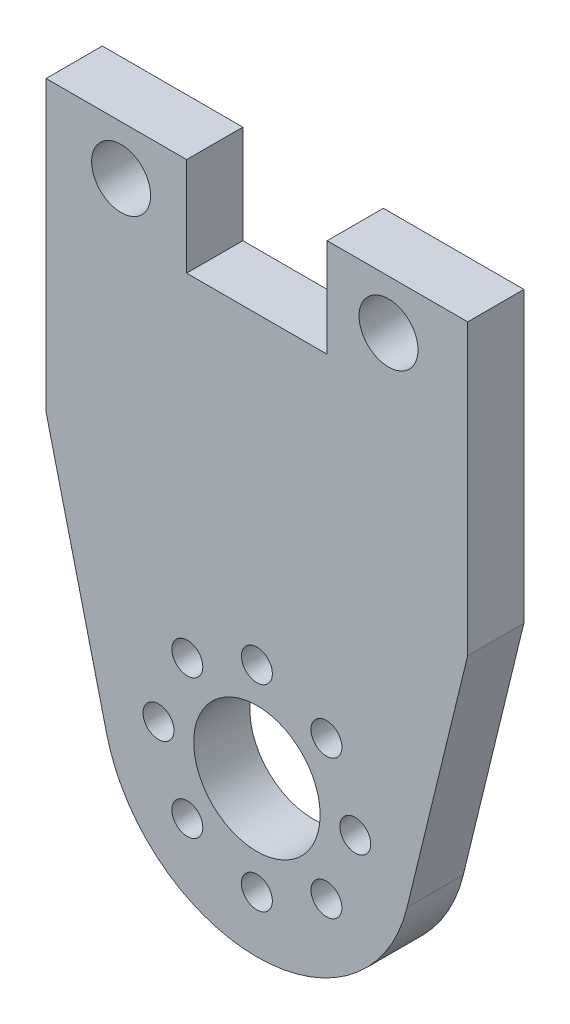
ISO-10303-21;
HEADER;
FILE_DESCRIPTION(('STEP AP214'),'2;1');
FILE_NAME('part.step','',(''),(''),'','','');
FILE_SCHEMA(('AUTOMOTIVE_DESIGN { 1 0 10303 214 1 1 1 1 }'));
ENDSEC;
DATA;
#1=APPLICATION_CONTEXT('core data for automotive mechanical design processes');
#2=APPLICATION_PROTOCOL_DEFINITION('international standard','automotive_design',2000,#1);
#3=PRODUCT_CONTEXT('',#1,'mechanical');
#4=PRODUCT('Part','Part','',(#3));
#5=PRODUCT_RELATED_PRODUCT_CATEGORY('part','',(#4));
#6=PRODUCT_DEFINITION_FORMATION('','',#4);
#7=PRODUCT_DEFINITION_CONTEXT('part definition',#1,'design');
#8=PRODUCT_DEFINITION('design','',#6,#7);
#9=PRODUCT_DEFINITION_SHAPE('','',#8);
#10=(LENGTH_UNIT() NAMED_UNIT(*) SI_UNIT(.MILLI.,.METRE.));
#11=(NAMED_UNIT(*) PLANE_ANGLE_UNIT() SI_UNIT($,.RADIAN.));
#12=(NAMED_UNIT(*) SI_UNIT($,.STERADIAN.) SOLID_ANGLE_UNIT());
#13=UNCERTAINTY_MEASURE_WITH_UNIT(LENGTH_MEASURE(1.E-05),#10,'distance_accuracy_value','');
#14=(GEOMETRIC_REPRESENTATION_CONTEXT(3) GLOBAL_UNCERTAINTY_ASSIGNED_CONTEXT((#13)) GLOBAL_UNIT_ASSIGNED_CONTEXT((#10,
#11,#12)) REPRESENTATION_CONTEXT('',''));
#15=CARTESIAN_POINT('',(0.,0.,0.));
#16=DIRECTION('',(0.,0.,1.));
#17=DIRECTION('',(1.,0.,0.));
#18=AXIS2_PLACEMENT_3D('',#15,#16,#17);
#19=CARTESIAN_POINT('',(-17.2832312773358,-4.21755964043624,4.));
#20=DIRECTION('',(0.971492674482312,0.237069575077032,0.));
#21=DIRECTION('',(-0.237069575077032,0.971492674482312,0.));
#22=AXIS2_PLACEMENT_3D('',#19,#20,#21);
#23=PLANE('',#22);
#24=DIRECTION('',(0.237069575077032,-0.971492674482312,0.));
#25=VECTOR('',#24,1.);
#26=CARTESIAN_POINT('',(-17.2832312773358,-4.21755964043624,0.));
#27=LINE('',#26,#25);
#28=CARTESIAN_POINT('',(-15.,-13.5740637779236,0.));
#29=VERTEX_POINT('',#28);
#30=CARTESIAN_POINT('',(-10.6864194193054,-31.2507813979398,0.));
#31=VERTEX_POINT('',#30);
#32=EDGE_CURVE('E173',#29,#31,#27,.T.);
#33=ORIENTED_EDGE('',*,*,#32,.T.);
#34=DIRECTION('',(0.,0.,-1.));
#35=VECTOR('',#34,1.);
#36=CARTESIAN_POINT('',(-10.6864194193054,-31.2507813979398,4.));
#37=LINE('',#36,#35);
#38=CARTESIAN_POINT('',(-10.6864194193054,-31.2507813979398,4.));
#39=VERTEX_POINT('',#38);
#40=EDGE_CURVE('E11',#39,#31,#37,.T.);
#41=ORIENTED_EDGE('',*,*,#40,.F.);
#42=DIRECTION('',(0.237069575077032,-0.971492674482312,0.));
#43=VECTOR('',#42,1.);
#44=CARTESIAN_POINT('',(-17.2832312773358,-4.21755964043624,4.));
#45=LINE('',#44,#43);
#46=CARTESIAN_POINT('',(-15.,-13.5740637779236,4.));
#47=VERTEX_POINT('',#46);
#48=EDGE_CURVE('E232',#47,#39,#45,.T.);
#49=ORIENTED_EDGE('',*,*,#48,.F.);
#50=DIRECTION('',(0.,0.,-1.));
#51=VECTOR('',#50,1.);
#52=CARTESIAN_POINT('',(-15.,-13.5740637779236,4.));
#53=LINE('',#52,#51);
#54=EDGE_CURVE('E52',#47,#29,#53,.T.);
#55=ORIENTED_EDGE('',*,*,#54,.T.);
#56=EDGE_LOOP('',(#33,#41,#49,#55));
#57=FACE_BOUND('',#56,.T.);
#58=ADVANCED_FACE('F35',(#57),#23,.F.);
#59=CARTESIAN_POINT('',(0.,-28.6430160720925,4.));
#60=DIRECTION('',(0.,0.,-1.));
#61=DIRECTION('',(-1.,0.,0.));
#62=AXIS2_PLACEMENT_3D('',#59,#60,#61);
#63=CYLINDRICAL_SURFACE('',#62,11.);
#64=CARTESIAN_POINT('',(0.,-28.6430160720925,0.));
#65=DIRECTION('',(0.,0.,1.));
#66=DIRECTION('',(1.,0.,0.));
#67=AXIS2_PLACEMENT_3D('',#64,#65,#66);
#68=CIRCLE('',#67,11.);
#69=CARTESIAN_POINT('',(10.6864194193054,-31.2507813979398,0.));
#70=VERTEX_POINT('',#69);
#71=EDGE_CURVE('E175',#31,#70,#68,.T.);
#72=ORIENTED_EDGE('',*,*,#71,.T.);
#73=DIRECTION('',(0.,0.,-1.));
#74=VECTOR('',#73,1.);
#75=CARTESIAN_POINT('',(10.6864194193054,-31.2507813979398,4.));
#76=LINE('',#75,#74);
#77=CARTESIAN_POINT('',(10.6864194193054,-31.2507813979398,4.));
#78=VERTEX_POINT('',#77);
#79=EDGE_CURVE('E44',#78,#70,#76,.T.);
#80=ORIENTED_EDGE('',*,*,#79,.F.);
#81=CARTESIAN_POINT('',(0.,-28.6430160720925,4.));
#82=DIRECTION('',(0.,0.,1.));
#83=DIRECTION('',(1.,0.,0.));
#84=AXIS2_PLACEMENT_3D('',#81,#82,#83);
#85=CIRCLE('',#84,11.);
#86=EDGE_CURVE('E96',#39,#78,#85,.T.);
#87=ORIENTED_EDGE('',*,*,#86,.F.);
#88=ORIENTED_EDGE('',*,*,#40,.T.);
#89=EDGE_LOOP('',(#72,#80,#87,#88));
#90=FACE_BOUND('',#89,.T.);
#91=ADVANCED_FACE('F216',(#90),#63,.T.);
#92=CARTESIAN_POINT('',(17.2832312773358,-4.21755964043625,4.));
#93=DIRECTION('',(0.971492674482312,-0.237069575077032,0.));
#94=DIRECTION('',(0.237069575077032,0.971492674482312,0.));
#95=AXIS2_PLACEMENT_3D('',#92,#93,#94);
#96=PLANE('',#95);
#97=DIRECTION('',(-0.237069575077032,-0.971492674482312,0.));
#98=VECTOR('',#97,1.);
#99=CARTESIAN_POINT('',(17.2832312773358,-4.21755964043625,0.));
#100=LINE('',#99,#98);
#101=CARTESIAN_POINT('',(15.,-13.5740637779236,0.));
#102=VERTEX_POINT('',#101);
#103=EDGE_CURVE('E178',#102,#70,#100,.T.);
#104=ORIENTED_EDGE('',*,*,#103,.F.);
#105=DIRECTION('',(0.,0.,-1.));
#106=VECTOR('',#105,1.);
#107=CARTESIAN_POINT('',(15.,-13.5740637779236,4.));
#108=LINE('',#107,#106);
#109=CARTESIAN_POINT('',(15.,-13.5740637779236,4.));
#110=VERTEX_POINT('',#109);
#111=EDGE_CURVE('E209',#110,#102,#108,.T.);
#112=ORIENTED_EDGE('',*,*,#111,.F.);
#113=DIRECTION('',(-0.237069575077032,-0.971492674482312,0.));
#114=VECTOR('',#113,1.);
#115=CARTESIAN_POINT('',(17.2832312773358,-4.21755964043625,4.));
#116=LINE('',#115,#114);
#117=EDGE_CURVE('E215',#110,#78,#116,.T.);
#118=ORIENTED_EDGE('',*,*,#117,.T.);
#119=ORIENTED_EDGE('',*,*,#79,.T.);
#120=EDGE_LOOP('',(#104,#112,#118,#119));
#121=FACE_BOUND('',#120,.T.);
#122=ADVANCED_FACE('F213',(#121),#96,.T.);
#123=CARTESIAN_POINT('',(15.,0.,4.));
#124=DIRECTION('',(1.,0.,0.));
#125=DIRECTION('',(0.,1.,0.));
#126=AXIS2_PLACEMENT_3D('',#123,#124,#125);
#127=PLANE('',#126);
#128=DIRECTION('',(0.,-1.,0.));
#129=VECTOR('',#128,1.);
#130=CARTESIAN_POINT('',(15.,0.,0.));
#131=LINE('',#130,#129);
#132=CARTESIAN_POINT('',(15.,7.,0.));
#133=VERTEX_POINT('',#132);
#134=EDGE_CURVE('E181',#133,#102,#131,.T.);
#135=ORIENTED_EDGE('',*,*,#134,.F.);
#136=DIRECTION('',(0.,0.,-1.));
#137=VECTOR('',#136,1.);
#138=CARTESIAN_POINT('',(15.,7.,4.));
#139=LINE('',#138,#137);
#140=CARTESIAN_POINT('',(15.,7.,4.));
#141=VERTEX_POINT('',#140);
#142=EDGE_CURVE('E207',#141,#133,#139,.T.);
#143=ORIENTED_EDGE('',*,*,#142,.F.);
#144=DIRECTION('',(0.,-1.,0.));
#145=VECTOR('',#144,1.);
#146=CARTESIAN_POINT('',(15.,0.,4.));
#147=LINE('',#146,#145);
#148=EDGE_CURVE('E226',#141,#110,#147,.T.);
#149=ORIENTED_EDGE('',*,*,#148,.T.);
#150=ORIENTED_EDGE('',*,*,#111,.T.);
#151=EDGE_LOOP('',(#135,#143,#149,#150));
#152=FACE_BOUND('',#151,.T.);
#153=ADVANCED_FACE('F223',(#152),#127,.T.);
#154=CARTESIAN_POINT('',(0.,7.,4.));
#155=DIRECTION('',(0.,1.,0.));
#156=DIRECTION('',(0.,0.,1.));
#157=AXIS2_PLACEMENT_3D('',#154,#155,#156);
#158=PLANE('',#157);
#159=DIRECTION('',(1.,0.,0.));
#160=VECTOR('',#159,1.);
#161=CARTESIAN_POINT('',(0.,7.,0.));
#162=LINE('',#161,#160);
#163=CARTESIAN_POINT('',(5.,7.,0.));
#164=VERTEX_POINT('',#163);
#165=EDGE_CURVE('E184',#164,#133,#162,.T.);
#166=ORIENTED_EDGE('',*,*,#165,.F.);
#167=DIRECTION('',(0.,0.,-1.));
#168=VECTOR('',#167,1.);
#169=CARTESIAN_POINT('',(5.,7.,4.));
#170=LINE('',#169,#168);
#171=CARTESIAN_POINT('',(5.,7.,4.));
#172=VERTEX_POINT('',#171);
#173=EDGE_CURVE('E205',#172,#164,#170,.T.);
#174=ORIENTED_EDGE('',*,*,#173,.F.);
#175=DIRECTION('',(1.,0.,0.));
#176=VECTOR('',#175,1.);
#177=CARTESIAN_POINT('',(0.,7.,4.));
#178=LINE('',#177,#176);
#179=EDGE_CURVE('E230',#172,#141,#178,.T.);
#180=ORIENTED_EDGE('',*,*,#179,.T.);
#181=ORIENTED_EDGE('',*,*,#142,.T.);
#182=EDGE_LOOP('',(#166,#174,#180,#181));
#183=FACE_BOUND('',#182,.T.);
#184=ADVANCED_FACE('F509',(#183),#158,.T.);
#185=CARTESIAN_POINT('',(5.,0.,4.));
#186=DIRECTION('',(-1.,0.,0.));
#187=DIRECTION('',(0.,-1.,0.));
#188=AXIS2_PLACEMENT_3D('',#185,#186,#187);
#189=PLANE('',#188);
#190=DIRECTION('',(0.,1.,0.));
#191=VECTOR('',#190,1.);
#192=CARTESIAN_POINT('',(5.,0.,0.));
#193=LINE('',#192,#191);
#194=CARTESIAN_POINT('',(5.,0.,0.));
#195=VERTEX_POINT('',#194);
#196=EDGE_CURVE('E187',#195,#164,#193,.T.);
#197=ORIENTED_EDGE('',*,*,#196,.F.);
#198=DIRECTION('',(0.,0.,-1.));
#199=VECTOR('',#198,1.);
#200=CARTESIAN_POINT('',(5.,0.,4.));
#201=LINE('',#200,#199);
#202=CARTESIAN_POINT('',(5.,0.,4.));
#203=VERTEX_POINT('',#202);
#204=EDGE_CURVE('E203',#203,#195,#201,.T.);
#205=ORIENTED_EDGE('',*,*,#204,.F.);
#206=DIRECTION('',(0.,1.,0.));
#207=VECTOR('',#206,1.);
#208=CARTESIAN_POINT('',(5.,0.,4.));
#209=LINE('',#208,#207);
#210=EDGE_CURVE('E237',#203,#172,#209,.T.);
#211=ORIENTED_EDGE('',*,*,#210,.T.);
#212=ORIENTED_EDGE('',*,*,#173,.T.);
#213=EDGE_LOOP('',(#197,#205,#211,#212));
#214=FACE_BOUND('',#213,.T.);
#215=ADVANCED_FACE('F500',(#214),#189,.T.);
#216=CARTESIAN_POINT('',(0.,0.,4.));
#217=DIRECTION('',(0.,1.,0.));
#218=DIRECTION('',(-1.,0.,0.));
#219=AXIS2_PLACEMENT_3D('',#216,#217,#218);
#220=PLANE('',#219);
#221=DIRECTION('',(1.,0.,0.));
#222=VECTOR('',#221,1.);
#223=CARTESIAN_POINT('',(0.,0.,0.));
#224=LINE('',#223,#222);
#225=CARTESIAN_POINT('',(-5.,0.,0.));
#226=VERTEX_POINT('',#225);
#227=EDGE_CURVE('E190',#226,#195,#224,.T.);
#228=ORIENTED_EDGE('',*,*,#227,.F.);
#229=DIRECTION('',(0.,0.,-1.));
#230=VECTOR('',#229,1.);
#231=CARTESIAN_POINT('',(-5.,0.,4.));
#232=LINE('',#231,#230);
#233=CARTESIAN_POINT('',(-5.,0.,4.));
#234=VERTEX_POINT('',#233);
#235=EDGE_CURVE('E127',#234,#226,#232,.T.);
#236=ORIENTED_EDGE('',*,*,#235,.F.);
#237=DIRECTION('',(1.,0.,0.));
#238=VECTOR('',#237,1.);
#239=CARTESIAN_POINT('',(0.,0.,4.));
#240=LINE('',#239,#238);
#241=EDGE_CURVE('E137',#234,#203,#240,.T.);
#242=ORIENTED_EDGE('',*,*,#241,.T.);
#243=ORIENTED_EDGE('',*,*,#204,.T.);
#244=EDGE_LOOP('',(#228,#236,#242,#243));
#245=FACE_BOUND('',#244,.T.);
#246=ADVANCED_FACE('F241',(#245),#220,.T.);
#247=CARTESIAN_POINT('',(-5.,0.,4.));
#248=DIRECTION('',(1.,0.,0.));
#249=DIRECTION('',(0.,0.,-1.));
#250=AXIS2_PLACEMENT_3D('',#247,#248,#249);
#251=PLANE('',#250);
#252=DIRECTION('',(0.,-1.,0.));
#253=VECTOR('',#252,1.);
#254=CARTESIAN_POINT('',(-5.,0.,0.));
#255=LINE('',#254,#253);
#256=CARTESIAN_POINT('',(-5.,7.,0.));
#257=VERTEX_POINT('',#256);
#258=EDGE_CURVE('E123',#257,#226,#255,.T.);
#259=ORIENTED_EDGE('',*,*,#258,.F.);
#260=DIRECTION('',(0.,0.,-1.));
#261=VECTOR('',#260,1.);
#262=CARTESIAN_POINT('',(-5.,7.,4.));
#263=LINE('',#262,#261);
#264=CARTESIAN_POINT('',(-5.,7.,4.));
#265=VERTEX_POINT('',#264);
#266=EDGE_CURVE('E118',#265,#257,#263,.T.);
#267=ORIENTED_EDGE('',*,*,#266,.F.);
#268=DIRECTION('',(0.,-1.,0.));
#269=VECTOR('',#268,1.);
#270=CARTESIAN_POINT('',(-5.,0.,4.));
#271=LINE('',#270,#269);
#272=EDGE_CURVE('E121',#265,#234,#271,.T.);
#273=ORIENTED_EDGE('',*,*,#272,.T.);
#274=ORIENTED_EDGE('',*,*,#235,.T.);
#275=EDGE_LOOP('',(#259,#267,#273,#274));
#276=FACE_BOUND('',#275,.T.);
#277=ADVANCED_FACE('F120',(#276),#251,.T.);
#278=CARTESIAN_POINT('',(0.,7.,4.));
#279=DIRECTION('',(0.,1.,0.));
#280=DIRECTION('',(0.,0.,1.));
#281=AXIS2_PLACEMENT_3D('',#278,#279,#280);
#282=PLANE('',#281);
#283=DIRECTION('',(1.,0.,0.));
#284=VECTOR('',#283,1.);
#285=CARTESIAN_POINT('',(0.,7.,0.));
#286=LINE('',#285,#284);
#287=CARTESIAN_POINT('',(-15.,7.,0.));
#288=VERTEX_POINT('',#287);
#289=EDGE_CURVE('E194',#288,#257,#286,.T.);
#290=ORIENTED_EDGE('',*,*,#289,.F.);
#291=DIRECTION('',(0.,0.,-1.));
#292=VECTOR('',#291,1.);
#293=CARTESIAN_POINT('',(-15.,7.,4.));
#294=LINE('',#293,#292);
#295=CARTESIAN_POINT('',(-15.,7.,4.));
#296=VERTEX_POINT('',#295);
#297=EDGE_CURVE('E84',#296,#288,#294,.T.);
#298=ORIENTED_EDGE('',*,*,#297,.F.);
#299=DIRECTION('',(1.,0.,0.));
#300=VECTOR('',#299,1.);
#301=CARTESIAN_POINT('',(0.,7.,4.));
#302=LINE('',#301,#300);
#303=EDGE_CURVE('E134',#296,#265,#302,.T.);
#304=ORIENTED_EDGE('',*,*,#303,.T.);
#305=ORIENTED_EDGE('',*,*,#266,.T.);
#306=EDGE_LOOP('',(#290,#298,#304,#305));
#307=FACE_BOUND('',#306,.T.);
#308=ADVANCED_FACE('F139',(#307),#282,.T.);
#309=CARTESIAN_POINT('',(-4.94974746830701,-23.6932686037855,4.));
#310=DIRECTION('',(0.,0.,-1.));
#311=DIRECTION('',(-1.,0.,0.));
#312=AXIS2_PLACEMENT_3D('',#309,#310,#311);
#313=CYLINDRICAL_SURFACE('',#312,1.1);
#314=CARTESIAN_POINT('',(-4.94974746830701,-23.6932686037855,4.));
#315=DIRECTION('',(0.,0.,1.));
#316=DIRECTION('',(1.,0.,0.));
#317=AXIS2_PLACEMENT_3D('',#314,#315,#316);
#318=CIRCLE('',#317,1.1);
#319=CARTESIAN_POINT('',(-3.84974746830701,-23.6932686037855,4.));
#320=VERTEX_POINT('',#319);
#321=EDGE_CURVE('E373',#320,#320,#318,.T.);
#322=ORIENTED_EDGE('',*,*,#321,.T.);
#323=EDGE_LOOP('',(#322));
#324=FACE_BOUND('',#323,.T.);
#325=CARTESIAN_POINT('',(-4.94974746830701,-23.6932686037855,0.));
#326=DIRECTION('',(0.,0.,1.));
#327=DIRECTION('',(1.,0.,0.));
#328=AXIS2_PLACEMENT_3D('',#325,#326,#327);
#329=CIRCLE('',#328,1.1);
#330=CARTESIAN_POINT('',(-3.84974746830701,-23.6932686037855,0.));
#331=VERTEX_POINT('',#330);
#332=EDGE_CURVE('E170',#331,#331,#329,.T.);
#333=ORIENTED_EDGE('',*,*,#332,.F.);
#334=EDGE_LOOP('',(#333));
#335=FACE_BOUND('',#334,.T.);
#336=ADVANCED_FACE('F264',(#324,#335),#313,.F.);
#337=CARTESIAN_POINT('',(-7.00000000000166,-28.6430160720925,4.));
#338=DIRECTION('',(0.,0.,-1.));
#339=DIRECTION('',(-1.,0.,0.));
#340=AXIS2_PLACEMENT_3D('',#337,#338,#339);
#341=CYLINDRICAL_SURFACE('',#340,1.1);
#342=CARTESIAN_POINT('',(-7.00000000000166,-28.6430160720925,4.));
#343=DIRECTION('',(0.,0.,1.));
#344=DIRECTION('',(1.,0.,0.));
#345=AXIS2_PLACEMENT_3D('',#342,#343,#344);
#346=CIRCLE('',#345,1.1);
#347=CARTESIAN_POINT('',(-5.90000000000166,-28.6430160720925,4.));
#348=VERTEX_POINT('',#347);
#349=EDGE_CURVE('E370',#348,#348,#346,.T.);
#350=ORIENTED_EDGE('',*,*,#349,.T.);
#351=EDGE_LOOP('',(#350));
#352=FACE_BOUND('',#351,.T.);
#353=CARTESIAN_POINT('',(-7.00000000000166,-28.6430160720925,0.));
#354=DIRECTION('',(0.,0.,1.));
#355=DIRECTION('',(1.,0.,0.));
#356=AXIS2_PLACEMENT_3D('',#353,#354,#355);
#357=CIRCLE('',#356,1.1);
#358=CARTESIAN_POINT('',(-5.90000000000166,-28.6430160720925,0.));
#359=VERTEX_POINT('',#358);
#360=EDGE_CURVE('E167',#359,#359,#357,.T.);
#361=ORIENTED_EDGE('',*,*,#360,.F.);
#362=EDGE_LOOP('',(#361));
#363=FACE_BOUND('',#362,.T.);
#364=ADVANCED_FACE('F267',(#352,#363),#341,.F.);
#365=CARTESIAN_POINT('',(-4.949747468307,-33.5927635403995,4.));
#366=DIRECTION('',(0.,0.,-1.));
#367=DIRECTION('',(-1.,0.,0.));
#368=AXIS2_PLACEMENT_3D('',#365,#366,#367);
#369=CYLINDRICAL_SURFACE('',#368,1.1);
#370=CARTESIAN_POINT('',(-4.949747468307,-33.5927635403995,4.));
#371=DIRECTION('',(0.,0.,1.));
#372=DIRECTION('',(1.,0.,0.));
#373=AXIS2_PLACEMENT_3D('',#370,#371,#372);
#374=CIRCLE('',#373,1.1);
#375=CARTESIAN_POINT('',(-3.849747468307,-33.5927635403995,4.));
#376=VERTEX_POINT('',#375);
#377=EDGE_CURVE('E367',#376,#376,#374,.T.);
#378=ORIENTED_EDGE('',*,*,#377,.T.);
#379=EDGE_LOOP('',(#378));
#380=FACE_BOUND('',#379,.T.);
#381=CARTESIAN_POINT('',(-4.949747468307,-33.5927635403995,0.));
#382=DIRECTION('',(0.,0.,1.));
#383=DIRECTION('',(1.,0.,0.));
#384=AXIS2_PLACEMENT_3D('',#381,#382,#383);
#385=CIRCLE('',#384,1.1);
#386=CARTESIAN_POINT('',(-3.849747468307,-33.5927635403995,0.));
#387=VERTEX_POINT('',#386);
#388=EDGE_CURVE('E164',#387,#387,#385,.T.);
#389=ORIENTED_EDGE('',*,*,#388,.F.);
#390=EDGE_LOOP('',(#389));
#391=FACE_BOUND('',#390,.T.);
#392=ADVANCED_FACE('F271',(#380,#391),#369,.F.);
#393=CARTESIAN_POINT('',(0.,-35.6430160720941,4.));
#394=DIRECTION('',(0.,0.,-1.));
#395=DIRECTION('',(-1.,0.,0.));
#396=AXIS2_PLACEMENT_3D('',#393,#394,#395);
#397=CYLINDRICAL_SURFACE('',#396,1.09999999999999);
#398=CARTESIAN_POINT('',(0.,-35.6430160720941,4.));
#399=DIRECTION('',(0.,0.,1.));
#400=DIRECTION('',(1.,0.,0.));
#401=AXIS2_PLACEMENT_3D('',#398,#399,#400);
#402=CIRCLE('',#401,1.09999999999999);
#403=CARTESIAN_POINT('',(1.09999999999999,-35.6430160720941,4.));
#404=VERTEX_POINT('',#403);
#405=EDGE_CURVE('E364',#404,#404,#402,.T.);
#406=ORIENTED_EDGE('',*,*,#405,.T.);
#407=EDGE_LOOP('',(#406));
#408=FACE_BOUND('',#407,.T.);
#409=CARTESIAN_POINT('',(0.,-35.6430160720941,0.));
#410=DIRECTION('',(0.,0.,1.));
#411=DIRECTION('',(1.,0.,0.));
#412=AXIS2_PLACEMENT_3D('',#409,#410,#411);
#413=CIRCLE('',#412,1.09999999999999);
#414=CARTESIAN_POINT('',(1.09999999999999,-35.6430160720941,0.));
#415=VERTEX_POINT('',#414);
#416=EDGE_CURVE('E161',#415,#415,#413,.T.);
#417=ORIENTED_EDGE('',*,*,#416,.F.);
#418=EDGE_LOOP('',(#417));
#419=FACE_BOUND('',#418,.T.);
#420=ADVANCED_FACE('F275',(#408,#419),#397,.F.);
#421=CARTESIAN_POINT('',(4.94974746830701,-33.5927635403995,4.));
#422=DIRECTION('',(0.,0.,-1.));
#423=DIRECTION('',(-1.,0.,0.));
#424=AXIS2_PLACEMENT_3D('',#421,#422,#423);
#425=CYLINDRICAL_SURFACE('',#424,1.09999999999999);
#426=CARTESIAN_POINT('',(4.94974746830701,-33.5927635403995,4.));
#427=DIRECTION('',(0.,0.,1.));
#428=DIRECTION('',(1.,0.,0.));
#429=AXIS2_PLACEMENT_3D('',#426,#427,#428);
#430=CIRCLE('',#429,1.09999999999999);
#431=CARTESIAN_POINT('',(6.049747468307,-33.5927635403995,4.));
#432=VERTEX_POINT('',#431);
#433=EDGE_CURVE('E361',#432,#432,#430,.T.);
#434=ORIENTED_EDGE('',*,*,#433,.T.);
#435=EDGE_LOOP('',(#434));
#436=FACE_BOUND('',#435,.T.);
#437=CARTESIAN_POINT('',(4.94974746830701,-33.5927635403995,0.));
#438=DIRECTION('',(0.,0.,1.));
#439=DIRECTION('',(1.,0.,0.));
#440=AXIS2_PLACEMENT_3D('',#437,#438,#439);
#441=CIRCLE('',#440,1.09999999999999);
#442=CARTESIAN_POINT('',(6.049747468307,-33.5927635403995,0.));
#443=VERTEX_POINT('',#442);
#444=EDGE_CURVE('E158',#443,#443,#441,.T.);
#445=ORIENTED_EDGE('',*,*,#444,.F.);
#446=EDGE_LOOP('',(#445));
#447=FACE_BOUND('',#446,.T.);
#448=ADVANCED_FACE('F279',(#436,#447),#425,.F.);
#449=CARTESIAN_POINT('',(7.00000000000167,-28.6430160720925,4.));
#450=DIRECTION('',(0.,0.,-1.));
#451=DIRECTION('',(-1.,0.,0.));
#452=AXIS2_PLACEMENT_3D('',#449,#450,#451);
#453=CYLINDRICAL_SURFACE('',#452,1.1);
#454=CARTESIAN_POINT('',(7.00000000000167,-28.6430160720925,4.));
#455=DIRECTION('',(0.,0.,1.));
#456=DIRECTION('',(1.,0.,0.));
#457=AXIS2_PLACEMENT_3D('',#454,#455,#456);
#458=CIRCLE('',#457,1.1);
#459=CARTESIAN_POINT('',(8.10000000000167,-28.6430160720925,4.));
#460=VERTEX_POINT('',#459);
#461=EDGE_CURVE('E358',#460,#460,#458,.T.);
#462=ORIENTED_EDGE('',*,*,#461,.T.);
#463=EDGE_LOOP('',(#462));
#464=FACE_BOUND('',#463,.T.);
#465=CARTESIAN_POINT('',(7.00000000000167,-28.6430160720925,0.));
#466=DIRECTION('',(0.,0.,1.));
#467=DIRECTION('',(1.,0.,0.));
#468=AXIS2_PLACEMENT_3D('',#465,#466,#467);
#469=CIRCLE('',#468,1.1);
#470=CARTESIAN_POINT('',(8.10000000000167,-28.6430160720925,0.));
#471=VERTEX_POINT('',#470);
#472=EDGE_CURVE('E155',#471,#471,#469,.T.);
#473=ORIENTED_EDGE('',*,*,#472,.F.);
#474=EDGE_LOOP('',(#473));
#475=FACE_BOUND('',#474,.T.);
#476=ADVANCED_FACE('F283',(#464,#475),#453,.F.);
#477=CARTESIAN_POINT('',(4.94974746830702,-23.6932686037855,4.));
#478=DIRECTION('',(0.,0.,-1.));
#479=DIRECTION('',(-1.,0.,0.));
#480=AXIS2_PLACEMENT_3D('',#477,#478,#479);
#481=CYLINDRICAL_SURFACE('',#480,1.1);
#482=CARTESIAN_POINT('',(4.94974746830702,-23.6932686037855,4.));
#483=DIRECTION('',(0.,0.,1.));
#484=DIRECTION('',(1.,0.,0.));
#485=AXIS2_PLACEMENT_3D('',#482,#483,#484);
#486=CIRCLE('',#485,1.1);
#487=CARTESIAN_POINT('',(6.04974746830702,-23.6932686037855,4.));
#488=VERTEX_POINT('',#487);
#489=EDGE_CURVE('E355',#488,#488,#486,.T.);
#490=ORIENTED_EDGE('',*,*,#489,.T.);
#491=EDGE_LOOP('',(#490));
#492=FACE_BOUND('',#491,.T.);
#493=CARTESIAN_POINT('',(4.94974746830702,-23.6932686037855,0.));
#494=DIRECTION('',(0.,0.,1.));
#495=DIRECTION('',(1.,0.,0.));
#496=AXIS2_PLACEMENT_3D('',#493,#494,#495);
#497=CIRCLE('',#496,1.1);
#498=CARTESIAN_POINT('',(6.04974746830702,-23.6932686037855,0.));
#499=VERTEX_POINT('',#498);
#500=EDGE_CURVE('E152',#499,#499,#497,.T.);
#501=ORIENTED_EDGE('',*,*,#500,.F.);
#502=EDGE_LOOP('',(#501));
#503=FACE_BOUND('',#502,.T.);
#504=ADVANCED_FACE('F287',(#492,#503),#481,.F.);
#505=CARTESIAN_POINT('',(0.,-21.6430160720908,4.));
#506=DIRECTION('',(0.,0.,-1.));
#507=DIRECTION('',(-1.,0.,0.));
#508=AXIS2_PLACEMENT_3D('',#505,#506,#507);
#509=CYLINDRICAL_SURFACE('',#508,1.1);
#510=CARTESIAN_POINT('',(0.,-21.6430160720908,4.));
#511=DIRECTION('',(0.,0.,1.));
#512=DIRECTION('',(1.,0.,0.));
#513=AXIS2_PLACEMENT_3D('',#510,#511,#512);
#514=CIRCLE('',#513,1.1);
#515=CARTESIAN_POINT('',(1.1,-21.6430160720908,4.));
#516=VERTEX_POINT('',#515);
#517=EDGE_CURVE('E298',#516,#516,#514,.T.);
#518=ORIENTED_EDGE('',*,*,#517,.T.);
#519=EDGE_LOOP('',(#518));
#520=FACE_BOUND('',#519,.T.);
#521=CARTESIAN_POINT('',(0.,-21.6430160720908,0.));
#522=DIRECTION('',(0.,0.,1.));
#523=DIRECTION('',(1.,0.,0.));
#524=AXIS2_PLACEMENT_3D('',#521,#522,#523);
#525=CIRCLE('',#524,1.1);
#526=CARTESIAN_POINT('',(1.1,-21.6430160720908,0.));
#527=VERTEX_POINT('',#526);
#528=EDGE_CURVE('E148',#527,#527,#525,.T.);
#529=ORIENTED_EDGE('',*,*,#528,.F.);
#530=EDGE_LOOP('',(#529));
#531=FACE_BOUND('',#530,.T.);
#532=ADVANCED_FACE('F252',(#520,#531),#509,.F.);
#533=CARTESIAN_POINT('',(0.,-28.6430160720925,4.));
#534=DIRECTION('',(0.,0.,-1.));
#535=DIRECTION('',(-1.,0.,0.));
#536=AXIS2_PLACEMENT_3D('',#533,#534,#535);
#537=CYLINDRICAL_SURFACE('',#536,4.5);
#538=CARTESIAN_POINT('',(0.,-28.6430160720925,4.));
#539=DIRECTION('',(0.,0.,1.));
#540=DIRECTION('',(1.,0.,0.));
#541=AXIS2_PLACEMENT_3D('',#538,#539,#540);
#542=CIRCLE('',#541,4.5);
#543=CARTESIAN_POINT('',(4.5,-28.6430160720925,4.));
#544=VERTEX_POINT('',#543);
#545=EDGE_CURVE('E199',#544,#544,#542,.T.);
#546=ORIENTED_EDGE('',*,*,#545,.T.);
#547=EDGE_LOOP('',(#546));
#548=FACE_BOUND('',#547,.T.);
#549=CARTESIAN_POINT('',(0.,-28.6430160720925,0.));
#550=DIRECTION('',(0.,0.,1.));
#551=DIRECTION('',(1.,0.,0.));
#552=AXIS2_PLACEMENT_3D('',#549,#550,#551);
#553=CIRCLE('',#552,4.5);
#554=CARTESIAN_POINT('',(4.5,-28.6430160720925,0.));
#555=VERTEX_POINT('',#554);
#556=EDGE_CURVE('E145',#555,#555,#553,.T.);
#557=ORIENTED_EDGE('',*,*,#556,.F.);
#558=EDGE_LOOP('',(#557));
#559=FACE_BOUND('',#558,.T.);
#560=ADVANCED_FACE('F37',(#548,#559),#537,.F.);
#561=CARTESIAN_POINT('',(-15.,0.,4.));
#562=DIRECTION('',(-1.,0.,0.));
#563=DIRECTION('',(0.,0.,1.));
#564=AXIS2_PLACEMENT_3D('',#561,#562,#563);
#565=PLANE('',#564);
#566=DIRECTION('',(0.,1.,0.));
#567=VECTOR('',#566,1.);
#568=CARTESIAN_POINT('',(-15.,0.,0.));
#569=LINE('',#568,#567);
#570=EDGE_CURVE('E196',#29,#288,#569,.T.);
#571=ORIENTED_EDGE('',*,*,#570,.F.);
#572=ORIENTED_EDGE('',*,*,#54,.F.);
#573=DIRECTION('',(0.,1.,0.));
#574=VECTOR('',#573,1.);
#575=CARTESIAN_POINT('',(-15.,0.,4.));
#576=LINE('',#575,#574);
#577=EDGE_CURVE('E140',#47,#296,#576,.T.);
#578=ORIENTED_EDGE('',*,*,#577,.T.);
#579=ORIENTED_EDGE('',*,*,#297,.T.);
#580=EDGE_LOOP('',(#571,#572,#578,#579));
#581=FACE_BOUND('',#580,.T.);
#582=ADVANCED_FACE('F243',(#581),#565,.T.);
#583=CARTESIAN_POINT('',(0.,0.,4.));
#584=DIRECTION('',(0.,0.,1.));
#585=DIRECTION('',(1.,0.,0.));
#586=AXIS2_PLACEMENT_3D('',#583,#584,#585);
#587=PLANE('',#586);
#588=CARTESIAN_POINT('',(9.36801540712669,3.49999999999751,4.));
#589=DIRECTION('',(0.,0.,-1.));
#590=DIRECTION('',(-1.,0.,0.));
#591=AXIS2_PLACEMENT_3D('',#588,#589,#590);
#592=CIRCLE('',#591,2.1);
#593=CARTESIAN_POINT('',(7.26801540712669,3.49999999999751,4.));
#594=VERTEX_POINT('',#593);
#595=EDGE_CURVE('E149',#594,#594,#592,.T.);
#596=ORIENTED_EDGE('',*,*,#595,.T.);
#597=EDGE_LOOP('',(#596));
#598=FACE_BOUND('',#597,.T.);
#599=CARTESIAN_POINT('',(-9.66360986057217,3.4999999999975,4.));
#600=DIRECTION('',(0.,0.,-1.));
#601=DIRECTION('',(-1.,0.,0.));
#602=AXIS2_PLACEMENT_3D('',#599,#600,#601);
#603=CIRCLE('',#602,2.1);
#604=CARTESIAN_POINT('',(-11.7636098605722,3.4999999999975,4.));
#605=VERTEX_POINT('',#604);
#606=EDGE_CURVE('E343',#605,#605,#603,.T.);
#607=ORIENTED_EDGE('',*,*,#606,.T.);
#608=EDGE_LOOP('',(#607));
#609=FACE_BOUND('',#608,.T.);
#610=ORIENTED_EDGE('',*,*,#545,.F.);
#611=EDGE_LOOP('',(#610));
#612=FACE_BOUND('',#611,.T.);
#613=ORIENTED_EDGE('',*,*,#517,.F.);
#614=EDGE_LOOP('',(#613));
#615=FACE_BOUND('',#614,.T.);
#616=ORIENTED_EDGE('',*,*,#489,.F.);
#617=EDGE_LOOP('',(#616));
#618=FACE_BOUND('',#617,.T.);
#619=ORIENTED_EDGE('',*,*,#461,.F.);
#620=EDGE_LOOP('',(#619));
#621=FACE_BOUND('',#620,.T.);
#622=ORIENTED_EDGE('',*,*,#433,.F.);
#623=EDGE_LOOP('',(#622));
#624=FACE_BOUND('',#623,.T.);
#625=ORIENTED_EDGE('',*,*,#405,.F.);
#626=EDGE_LOOP('',(#625));
#627=FACE_BOUND('',#626,.T.);
#628=ORIENTED_EDGE('',*,*,#377,.F.);
#629=EDGE_LOOP('',(#628));
#630=FACE_BOUND('',#629,.T.);
#631=ORIENTED_EDGE('',*,*,#349,.F.);
#632=EDGE_LOOP('',(#631));
#633=FACE_BOUND('',#632,.T.);
#634=ORIENTED_EDGE('',*,*,#321,.F.);
#635=EDGE_LOOP('',(#634));
#636=FACE_BOUND('',#635,.T.);
#637=ORIENTED_EDGE('',*,*,#48,.T.);
#638=ORIENTED_EDGE('',*,*,#86,.T.);
#639=ORIENTED_EDGE('',*,*,#117,.F.);
#640=ORIENTED_EDGE('',*,*,#148,.F.);
#641=ORIENTED_EDGE('',*,*,#179,.F.);
#642=ORIENTED_EDGE('',*,*,#210,.F.);
#643=ORIENTED_EDGE('',*,*,#241,.F.);
#644=ORIENTED_EDGE('',*,*,#272,.F.);
#645=ORIENTED_EDGE('',*,*,#303,.F.);
#646=ORIENTED_EDGE('',*,*,#577,.F.);
#647=EDGE_LOOP('',(#637,#638,#639,#640,#641,#642,#643,#644,#645,#646));
#648=FACE_BOUND('',#647,.T.);
#649=ADVANCED_FACE('F132',(#598,#609,#612,#615,#618,#621,#624,#627,#630,#633,#636,#648),#587,.T.);
#650=CARTESIAN_POINT('',(0.,0.,0.));
#651=DIRECTION('',(0.,0.,1.));
#652=DIRECTION('',(1.,0.,0.));
#653=AXIS2_PLACEMENT_3D('',#650,#651,#652);
#654=PLANE('',#653);
#655=CARTESIAN_POINT('',(9.36801540712669,3.49999999999751,0.));
#656=DIRECTION('',(0.,0.,-1.));
#657=DIRECTION('',(-1.,0.,0.));
#658=AXIS2_PLACEMENT_3D('',#655,#656,#657);
#659=CIRCLE('',#658,2.1);
#660=CARTESIAN_POINT('',(7.26801540712669,3.49999999999751,0.));
#661=VERTEX_POINT('',#660);
#662=EDGE_CURVE('E342',#661,#661,#659,.T.);
#663=ORIENTED_EDGE('',*,*,#662,.F.);
#664=EDGE_LOOP('',(#663));
#665=FACE_BOUND('',#664,.T.);
#666=CARTESIAN_POINT('',(-9.66360986057217,3.4999999999975,0.));
#667=DIRECTION('',(0.,0.,-1.));
#668=DIRECTION('',(-1.,0.,0.));
#669=AXIS2_PLACEMENT_3D('',#666,#667,#668);
#670=CIRCLE('',#669,2.1);
#671=CARTESIAN_POINT('',(-11.7636098605722,3.4999999999975,0.));
#672=VERTEX_POINT('',#671);
#673=EDGE_CURVE('E347',#672,#672,#670,.T.);
#674=ORIENTED_EDGE('',*,*,#673,.F.);
#675=EDGE_LOOP('',(#674));
#676=FACE_BOUND('',#675,.T.);
#677=ORIENTED_EDGE('',*,*,#556,.T.);
#678=EDGE_LOOP('',(#677));
#679=FACE_BOUND('',#678,.T.);
#680=ORIENTED_EDGE('',*,*,#528,.T.);
#681=EDGE_LOOP('',(#680));
#682=FACE_BOUND('',#681,.T.);
#683=ORIENTED_EDGE('',*,*,#500,.T.);
#684=EDGE_LOOP('',(#683));
#685=FACE_BOUND('',#684,.T.);
#686=ORIENTED_EDGE('',*,*,#472,.T.);
#687=EDGE_LOOP('',(#686));
#688=FACE_BOUND('',#687,.T.);
#689=ORIENTED_EDGE('',*,*,#444,.T.);
#690=EDGE_LOOP('',(#689));
#691=FACE_BOUND('',#690,.T.);
#692=ORIENTED_EDGE('',*,*,#416,.T.);
#693=EDGE_LOOP('',(#692));
#694=FACE_BOUND('',#693,.T.);
#695=ORIENTED_EDGE('',*,*,#388,.T.);
#696=EDGE_LOOP('',(#695));
#697=FACE_BOUND('',#696,.T.);
#698=ORIENTED_EDGE('',*,*,#360,.T.);
#699=EDGE_LOOP('',(#698));
#700=FACE_BOUND('',#699,.T.);
#701=ORIENTED_EDGE('',*,*,#332,.T.);
#702=EDGE_LOOP('',(#701));
#703=FACE_BOUND('',#702,.T.);
#704=ORIENTED_EDGE('',*,*,#32,.F.);
#705=ORIENTED_EDGE('',*,*,#570,.T.);
#706=ORIENTED_EDGE('',*,*,#289,.T.);
#707=ORIENTED_EDGE('',*,*,#258,.T.);
#708=ORIENTED_EDGE('',*,*,#227,.T.);
#709=ORIENTED_EDGE('',*,*,#196,.T.);
#710=ORIENTED_EDGE('',*,*,#165,.T.);
#711=ORIENTED_EDGE('',*,*,#134,.T.);
#712=ORIENTED_EDGE('',*,*,#103,.T.);
#713=ORIENTED_EDGE('',*,*,#71,.F.);
#714=EDGE_LOOP('',(#704,#705,#706,#707,#708,#709,#710,#711,#712,#713));
#715=FACE_BOUND('',#714,.T.);
#716=ADVANCED_FACE('F219',(#665,#676,#679,#682,#685,#688,#691,#694,#697,#700,#703,#715),#654,.F.);
#717=CARTESIAN_POINT('',(-9.66360986057217,3.4999999999975,4.));
#718=DIRECTION('',(0.,0.,-1.));
#719=DIRECTION('',(-1.,0.,0.));
#720=AXIS2_PLACEMENT_3D('',#717,#718,#719);
#721=CYLINDRICAL_SURFACE('',#720,2.1);
#722=ORIENTED_EDGE('',*,*,#606,.F.);
#723=EDGE_LOOP('',(#722));
#724=FACE_BOUND('',#723,.T.);
#725=ORIENTED_EDGE('',*,*,#673,.T.);
#726=EDGE_LOOP('',(#725));
#727=FACE_BOUND('',#726,.T.);
#728=ADVANCED_FACE('F303',(#724,#727),#721,.F.);
#729=CARTESIAN_POINT('',(9.36801540712669,3.49999999999751,4.));
#730=DIRECTION('',(0.,0.,-1.));
#731=DIRECTION('',(-1.,0.,0.));
#732=AXIS2_PLACEMENT_3D('',#729,#730,#731);
#733=CYLINDRICAL_SURFACE('',#732,2.1);
#734=ORIENTED_EDGE('',*,*,#595,.F.);
#735=EDGE_LOOP('',(#734));
#736=FACE_BOUND('',#735,.T.);
#737=ORIENTED_EDGE('',*,*,#662,.T.);
#738=EDGE_LOOP('',(#737));
#739=FACE_BOUND('',#738,.T.);
#740=ADVANCED_FACE('F328',(#736,#739),#733,.F.);
#741=CLOSED_SHELL('',(#58,#91,#122,#153,#184,#215,#246,#277,#308,#336,#364,#392,#420,#448,#476,
#504,#532,#560,#582,#649,#716,#728,#740));
#742=MANIFOLD_SOLID_BREP('B2',#741);
#743=ADVANCED_BREP_SHAPE_REPRESENTATION('',(#18,#742),#14);
#744=SHAPE_DEFINITION_REPRESENTATION(#9,#743);
ENDSEC;
END-ISO-10303-21;
